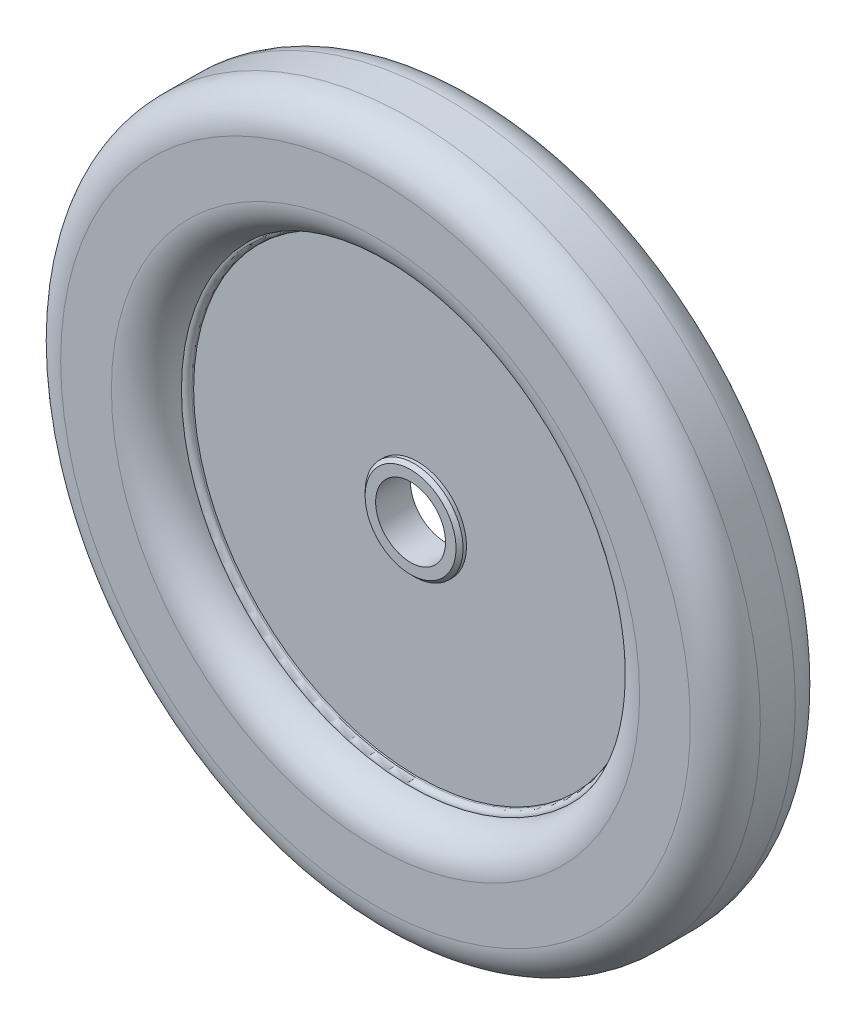
ISO-10303-21;
HEADER;
FILE_DESCRIPTION(('STEP AP214'),'2;1');
FILE_NAME('part.step','',(''),(''),'','','');
FILE_SCHEMA(('AUTOMOTIVE_DESIGN { 1 0 10303 214 1 1 1 1 }'));
ENDSEC;
DATA;
#1=APPLICATION_CONTEXT('core data for automotive mechanical design processes');
#2=APPLICATION_PROTOCOL_DEFINITION('international standard','automotive_design',2000,#1);
#3=PRODUCT_CONTEXT('',#1,'mechanical');
#4=PRODUCT('Part','Part','',(#3));
#5=PRODUCT_RELATED_PRODUCT_CATEGORY('part','',(#4));
#6=PRODUCT_DEFINITION_FORMATION('','',#4);
#7=PRODUCT_DEFINITION_CONTEXT('part definition',#1,'design');
#8=PRODUCT_DEFINITION('design','',#6,#7);
#9=PRODUCT_DEFINITION_SHAPE('','',#8);
#10=(LENGTH_UNIT() NAMED_UNIT(*) SI_UNIT(.MILLI.,.METRE.));
#11=(NAMED_UNIT(*) PLANE_ANGLE_UNIT() SI_UNIT($,.RADIAN.));
#12=(NAMED_UNIT(*) SI_UNIT($,.STERADIAN.) SOLID_ANGLE_UNIT());
#13=UNCERTAINTY_MEASURE_WITH_UNIT(LENGTH_MEASURE(1.E-05),#10,'distance_accuracy_value','');
#14=(GEOMETRIC_REPRESENTATION_CONTEXT(3) GLOBAL_UNCERTAINTY_ASSIGNED_CONTEXT((#13)) GLOBAL_UNIT_ASSIGNED_CONTEXT((#10,
#11,#12)) REPRESENTATION_CONTEXT('',''));
#15=CARTESIAN_POINT('',(0.,0.,0.));
#16=DIRECTION('',(0.,0.,1.));
#17=DIRECTION('',(1.,0.,0.));
#18=AXIS2_PLACEMENT_3D('',#15,#16,#17);
#19=CARTESIAN_POINT('',(0.,0.,-9.95860279538102));
#20=DIRECTION('',(0.,0.,-1.));
#21=DIRECTION('',(-1.,0.,0.));
#22=AXIS2_PLACEMENT_3D('',#19,#20,#21);
#23=CYLINDRICAL_SURFACE('',#22,10.);
#24=CARTESIAN_POINT('',(0.,0.,0.));
#25=DIRECTION('',(0.,0.,-1.));
#26=DIRECTION('',(-1.,0.,0.));
#27=AXIS2_PLACEMENT_3D('',#24,#25,#26);
#28=CIRCLE('',#27,10.);
#29=CARTESIAN_POINT('',(-10.,0.,0.));
#30=VERTEX_POINT('',#29);
#31=EDGE_CURVE('E10',#30,#30,#28,.T.);
#32=ORIENTED_EDGE('',*,*,#31,.F.);
#33=EDGE_LOOP('',(#32));
#34=FACE_BOUND('',#33,.T.);
#35=CARTESIAN_POINT('',(0.,0.,-9.95860279538102));
#36=DIRECTION('',(0.,0.,-1.));
#37=DIRECTION('',(-1.,0.,0.));
#38=AXIS2_PLACEMENT_3D('',#35,#36,#37);
#39=CIRCLE('',#38,10.);
#40=CARTESIAN_POINT('',(-10.,0.,-9.95860279538102));
#41=VERTEX_POINT('',#40);
#42=EDGE_CURVE('E100',#41,#41,#39,.T.);
#43=ORIENTED_EDGE('',*,*,#42,.T.);
#44=EDGE_LOOP('',(#43));
#45=FACE_BOUND('',#44,.T.);
#46=ADVANCED_FACE('F30',(#34,#45),#23,.F.);
#47=CARTESIAN_POINT('',(10.,0.,0.));
#48=DIRECTION('',(0.,0.,-1.));
#49=DIRECTION('',(-1.,0.,0.));
#50=AXIS2_PLACEMENT_3D('',#47,#48,#49);
#51=PLANE('',#50);
#52=CARTESIAN_POINT('',(0.,0.,0.));
#53=DIRECTION('',(0.,0.,-1.));
#54=DIRECTION('',(-1.,0.,0.));
#55=AXIS2_PLACEMENT_3D('',#52,#53,#54);
#56=CIRCLE('',#55,13.);
#57=CARTESIAN_POINT('',(-13.,0.,0.));
#58=VERTEX_POINT('',#57);
#59=EDGE_CURVE('E36',#58,#58,#56,.T.);
#60=ORIENTED_EDGE('',*,*,#59,.F.);
#61=EDGE_LOOP('',(#60));
#62=FACE_BOUND('',#61,.T.);
#63=ORIENTED_EDGE('',*,*,#31,.T.);
#64=EDGE_LOOP('',(#63));
#65=FACE_BOUND('',#64,.T.);
#66=ADVANCED_FACE('F221',(#62,#65),#51,.F.);
#67=CARTESIAN_POINT('',(0.,0.,0.));
#68=DIRECTION('',(0.,0.,-1.));
#69=DIRECTION('',(-1.,0.,0.));
#70=AXIS2_PLACEMENT_3D('',#67,#68,#69);
#71=CONICAL_SURFACE('',#70,13.,0.785398163397448);
#72=CARTESIAN_POINT('',(0.,0.,-1.));
#73=DIRECTION('',(0.,0.,-1.));
#74=DIRECTION('',(-1.,0.,0.));
#75=AXIS2_PLACEMENT_3D('',#72,#73,#74);
#76=CIRCLE('',#75,14.);
#77=CARTESIAN_POINT('',(-14.,0.,-1.));
#78=VERTEX_POINT('',#77);
#79=EDGE_CURVE('E40',#78,#78,#76,.T.);
#80=ORIENTED_EDGE('',*,*,#79,.F.);
#81=EDGE_LOOP('',(#80));
#82=FACE_BOUND('',#81,.T.);
#83=ORIENTED_EDGE('',*,*,#59,.T.);
#84=EDGE_LOOP('',(#83));
#85=FACE_BOUND('',#84,.T.);
#86=ADVANCED_FACE('F216',(#82,#85),#71,.T.);
#87=CARTESIAN_POINT('',(0.,0.,-9.95860279538102));
#88=DIRECTION('',(0.,0.,-1.));
#89=DIRECTION('',(-1.,0.,0.));
#90=AXIS2_PLACEMENT_3D('',#87,#88,#89);
#91=CYLINDRICAL_SURFACE('',#90,14.);
#92=CARTESIAN_POINT('',(0.,0.,-1.97930139769048));
#93=DIRECTION('',(0.,0.,-1.));
#94=DIRECTION('',(-1.,0.,0.));
#95=AXIS2_PLACEMENT_3D('',#92,#93,#94);
#96=CIRCLE('',#95,14.);
#97=CARTESIAN_POINT('',(-14.,0.,-1.97930139769048));
#98=VERTEX_POINT('',#97);
#99=EDGE_CURVE('E44',#98,#98,#96,.T.);
#100=ORIENTED_EDGE('',*,*,#99,.F.);
#101=EDGE_LOOP('',(#100));
#102=FACE_BOUND('',#101,.T.);
#103=ORIENTED_EDGE('',*,*,#79,.T.);
#104=EDGE_LOOP('',(#103));
#105=FACE_BOUND('',#104,.T.);
#106=ADVANCED_FACE('F210',(#102,#105),#91,.T.);
#107=CARTESIAN_POINT('',(14.,0.,-1.97930139769048));
#108=DIRECTION('',(0.,0.,-1.));
#109=DIRECTION('',(-1.,0.,0.));
#110=AXIS2_PLACEMENT_3D('',#107,#108,#109);
#111=PLANE('',#110);
#112=CARTESIAN_POINT('',(0.,0.,-1.97930139769048));
#113=DIRECTION('',(0.,0.,-1.));
#114=DIRECTION('',(-1.,0.,0.));
#115=AXIS2_PLACEMENT_3D('',#112,#113,#114);
#116=CIRCLE('',#115,64.);
#117=CARTESIAN_POINT('',(-64.,0.,-1.97930139769048));
#118=VERTEX_POINT('',#117);
#119=EDGE_CURVE('E49',#118,#118,#116,.T.);
#120=ORIENTED_EDGE('',*,*,#119,.F.);
#121=EDGE_LOOP('',(#120));
#122=FACE_BOUND('',#121,.T.);
#123=ORIENTED_EDGE('',*,*,#99,.T.);
#124=EDGE_LOOP('',(#123));
#125=FACE_BOUND('',#124,.T.);
#126=ADVANCED_FACE('F204',(#122,#125),#111,.F.);
#127=CARTESIAN_POINT('',(0.,0.,-9.95860279538102));
#128=DIRECTION('',(0.,0.,-1.));
#129=DIRECTION('',(-1.,0.,0.));
#130=AXIS2_PLACEMENT_3D('',#127,#128,#129);
#131=CYLINDRICAL_SURFACE('',#130,64.);
#132=CARTESIAN_POINT('',(0.,0.,-1.5));
#133=DIRECTION('',(0.,0.,-1.));
#134=DIRECTION('',(-1.,0.,0.));
#135=AXIS2_PLACEMENT_3D('',#132,#133,#134);
#136=CIRCLE('',#135,64.);
#137=CARTESIAN_POINT('',(-64.,0.,-1.5));
#138=VERTEX_POINT('',#137);
#139=EDGE_CURVE('E52',#138,#138,#136,.T.);
#140=ORIENTED_EDGE('',*,*,#139,.F.);
#141=EDGE_LOOP('',(#140));
#142=FACE_BOUND('',#141,.T.);
#143=ORIENTED_EDGE('',*,*,#119,.T.);
#144=EDGE_LOOP('',(#143));
#145=FACE_BOUND('',#144,.T.);
#146=ADVANCED_FACE('F198',(#142,#145),#131,.F.);
#147=CARTESIAN_POINT('',(0.,0.,-1.5));
#148=DIRECTION('',(0.,0.,-1.));
#149=DIRECTION('',(-1.,0.,0.));
#150=AXIS2_PLACEMENT_3D('',#147,#148,#149);
#151=TOROIDAL_SURFACE('',#150,65.5,1.5);
#152=CARTESIAN_POINT('',(0.,0.,0.));
#153=DIRECTION('',(0.,0.,-1.));
#154=DIRECTION('',(-1.,0.,0.));
#155=AXIS2_PLACEMENT_3D('',#152,#153,#154);
#156=CIRCLE('',#155,65.5);
#157=CARTESIAN_POINT('',(-65.5,0.,0.));
#158=VERTEX_POINT('',#157);
#159=EDGE_CURVE('E55',#158,#158,#156,.T.);
#160=ORIENTED_EDGE('',*,*,#159,.F.);
#161=EDGE_LOOP('',(#160));
#162=FACE_BOUND('',#161,.T.);
#163=ORIENTED_EDGE('',*,*,#139,.T.);
#164=EDGE_LOOP('',(#163));
#165=FACE_BOUND('',#164,.T.);
#166=ADVANCED_FACE('F192',(#162,#165),#151,.T.);
#167=CARTESIAN_POINT('',(0.,0.,-9.95860279538102));
#168=DIRECTION('',(0.,0.,-1.));
#169=DIRECTION('',(-1.,0.,0.));
#170=AXIS2_PLACEMENT_3D('',#167,#168,#169);
#171=CYLINDRICAL_SURFACE('',#170,65.5);
#172=CARTESIAN_POINT('',(0.,0.,0.0206986023094102));
#173=DIRECTION('',(0.,0.,-1.));
#174=DIRECTION('',(-1.,0.,0.));
#175=AXIS2_PLACEMENT_3D('',#172,#173,#174);
#176=CIRCLE('',#175,65.5);
#177=CARTESIAN_POINT('',(-65.5,0.,0.0206986023094102));
#178=VERTEX_POINT('',#177);
#179=EDGE_CURVE('E58',#178,#178,#176,.T.);
#180=ORIENTED_EDGE('',*,*,#179,.F.);
#181=EDGE_LOOP('',(#180));
#182=FACE_BOUND('',#181,.T.);
#183=ORIENTED_EDGE('',*,*,#159,.T.);
#184=EDGE_LOOP('',(#183));
#185=FACE_BOUND('',#184,.T.);
#186=ADVANCED_FACE('F186',(#182,#185),#171,.F.);
#187=CARTESIAN_POINT('',(0.,0.,0.0206986023095213));
#188=DIRECTION('',(0.,0.,-1.));
#189=DIRECTION('',(-1.,0.,0.));
#190=AXIS2_PLACEMENT_3D('',#187,#188,#189);
#191=TOROIDAL_SURFACE('',#190,75.5,10.);
#192=CARTESIAN_POINT('',(0.,0.,10.0206986023095));
#193=DIRECTION('',(0.,0.,-1.));
#194=DIRECTION('',(-1.,0.,0.));
#195=AXIS2_PLACEMENT_3D('',#192,#193,#194);
#196=CIRCLE('',#195,75.5);
#197=CARTESIAN_POINT('',(-75.5,0.,10.0206986023095));
#198=VERTEX_POINT('',#197);
#199=EDGE_CURVE('E61',#198,#198,#196,.T.);
#200=ORIENTED_EDGE('',*,*,#199,.F.);
#201=EDGE_LOOP('',(#200));
#202=FACE_BOUND('',#201,.T.);
#203=ORIENTED_EDGE('',*,*,#179,.T.);
#204=EDGE_LOOP('',(#203));
#205=FACE_BOUND('',#204,.T.);
#206=ADVANCED_FACE('F180',(#202,#205),#191,.T.);
#207=CARTESIAN_POINT('',(75.5000000000001,0.,10.0206986023095));
#208=DIRECTION('',(0.,0.,-1.));
#209=DIRECTION('',(-1.,0.,0.));
#210=AXIS2_PLACEMENT_3D('',#207,#208,#209);
#211=PLANE('',#210);
#212=CARTESIAN_POINT('',(0.,0.,10.0206986023095));
#213=DIRECTION('',(0.,0.,-1.));
#214=DIRECTION('',(-1.,0.,0.));
#215=AXIS2_PLACEMENT_3D('',#212,#213,#214);
#216=CIRCLE('',#215,89.9999999999999);
#217=CARTESIAN_POINT('',(-89.9999999999999,0.,10.0206986023095));
#218=VERTEX_POINT('',#217);
#219=EDGE_CURVE('E64',#218,#218,#216,.T.);
#220=ORIENTED_EDGE('',*,*,#219,.F.);
#221=EDGE_LOOP('',(#220));
#222=FACE_BOUND('',#221,.T.);
#223=ORIENTED_EDGE('',*,*,#199,.T.);
#224=EDGE_LOOP('',(#223));
#225=FACE_BOUND('',#224,.T.);
#226=ADVANCED_FACE('F174',(#222,#225),#211,.F.);
#227=CARTESIAN_POINT('',(0.,0.,0.0206986023095213));
#228=DIRECTION('',(0.,0.,-1.));
#229=DIRECTION('',(-1.,0.,0.));
#230=AXIS2_PLACEMENT_3D('',#227,#228,#229);
#231=TOROIDAL_SURFACE('',#230,90.,10.);
#232=CARTESIAN_POINT('',(0.,0.,0.0206986023094102));
#233=DIRECTION('',(0.,0.,-1.));
#234=DIRECTION('',(-1.,0.,0.));
#235=AXIS2_PLACEMENT_3D('',#232,#233,#234);
#236=CIRCLE('',#235,100.);
#237=CARTESIAN_POINT('',(-100.,0.,0.0206986023094102));
#238=VERTEX_POINT('',#237);
#239=EDGE_CURVE('E67',#238,#238,#236,.T.);
#240=ORIENTED_EDGE('',*,*,#239,.F.);
#241=EDGE_LOOP('',(#240));
#242=FACE_BOUND('',#241,.T.);
#243=ORIENTED_EDGE('',*,*,#219,.T.);
#244=EDGE_LOOP('',(#243));
#245=FACE_BOUND('',#244,.T.);
#246=ADVANCED_FACE('F168',(#242,#245),#231,.T.);
#247=CARTESIAN_POINT('',(0.,0.,-9.95860279538102));
#248=DIRECTION('',(0.,0.,-1.));
#249=DIRECTION('',(-1.,0.,0.));
#250=AXIS2_PLACEMENT_3D('',#247,#248,#249);
#251=CYLINDRICAL_SURFACE('',#250,100.);
#252=CARTESIAN_POINT('',(0.,0.,-9.97930139769043));
#253=DIRECTION('',(0.,0.,-1.));
#254=DIRECTION('',(-1.,0.,0.));
#255=AXIS2_PLACEMENT_3D('',#252,#253,#254);
#256=CIRCLE('',#255,100.);
#257=CARTESIAN_POINT('',(-100.,0.,-9.97930139769043));
#258=VERTEX_POINT('',#257);
#259=EDGE_CURVE('E70',#258,#258,#256,.T.);
#260=ORIENTED_EDGE('',*,*,#259,.F.);
#261=EDGE_LOOP('',(#260));
#262=FACE_BOUND('',#261,.T.);
#263=ORIENTED_EDGE('',*,*,#239,.T.);
#264=EDGE_LOOP('',(#263));
#265=FACE_BOUND('',#264,.T.);
#266=ADVANCED_FACE('F162',(#262,#265),#251,.T.);
#267=CARTESIAN_POINT('',(0.,0.,-9.97930139769049));
#268=DIRECTION('',(0.,0.,-1.));
#269=DIRECTION('',(-1.,0.,0.));
#270=AXIS2_PLACEMENT_3D('',#267,#268,#269);
#271=TOROIDAL_SURFACE('',#270,90.,10.);
#272=CARTESIAN_POINT('',(0.,0.,-19.9793013976905));
#273=DIRECTION('',(0.,0.,-1.));
#274=DIRECTION('',(-1.,0.,0.));
#275=AXIS2_PLACEMENT_3D('',#272,#273,#274);
#276=CIRCLE('',#275,89.9999999999999);
#277=CARTESIAN_POINT('',(-89.9999999999999,0.,-19.9793013976905));
#278=VERTEX_POINT('',#277);
#279=EDGE_CURVE('E73',#278,#278,#276,.T.);
#280=ORIENTED_EDGE('',*,*,#279,.F.);
#281=EDGE_LOOP('',(#280));
#282=FACE_BOUND('',#281,.T.);
#283=ORIENTED_EDGE('',*,*,#259,.T.);
#284=EDGE_LOOP('',(#283));
#285=FACE_BOUND('',#284,.T.);
#286=ADVANCED_FACE('F156',(#282,#285),#271,.T.);
#287=CARTESIAN_POINT('',(75.5000000000001,0.,-19.9793013976905));
#288=DIRECTION('',(0.,0.,1.));
#289=DIRECTION('',(1.,0.,0.));
#290=AXIS2_PLACEMENT_3D('',#287,#288,#289);
#291=PLANE('',#290);
#292=CARTESIAN_POINT('',(0.,0.,-19.9793013976905));
#293=DIRECTION('',(0.,0.,-1.));
#294=DIRECTION('',(-1.,0.,0.));
#295=AXIS2_PLACEMENT_3D('',#292,#293,#294);
#296=CIRCLE('',#295,75.5000000000001);
#297=CARTESIAN_POINT('',(-75.5000000000001,0.,-19.9793013976905));
#298=VERTEX_POINT('',#297);
#299=EDGE_CURVE('E76',#298,#298,#296,.T.);
#300=ORIENTED_EDGE('',*,*,#299,.F.);
#301=EDGE_LOOP('',(#300));
#302=FACE_BOUND('',#301,.T.);
#303=ORIENTED_EDGE('',*,*,#279,.T.);
#304=EDGE_LOOP('',(#303));
#305=FACE_BOUND('',#304,.T.);
#306=ADVANCED_FACE('F150',(#302,#305),#291,.F.);
#307=CARTESIAN_POINT('',(0.,0.,-9.97930139769049));
#308=DIRECTION('',(0.,0.,-1.));
#309=DIRECTION('',(-1.,0.,0.));
#310=AXIS2_PLACEMENT_3D('',#307,#308,#309);
#311=TOROIDAL_SURFACE('',#310,75.5,10.);
#312=CARTESIAN_POINT('',(0.,0.,-9.97930139769043));
#313=DIRECTION('',(0.,0.,-1.));
#314=DIRECTION('',(-1.,0.,0.));
#315=AXIS2_PLACEMENT_3D('',#312,#313,#314);
#316=CIRCLE('',#315,65.5);
#317=CARTESIAN_POINT('',(-65.5,0.,-9.97930139769043));
#318=VERTEX_POINT('',#317);
#319=EDGE_CURVE('E79',#318,#318,#316,.T.);
#320=ORIENTED_EDGE('',*,*,#319,.F.);
#321=EDGE_LOOP('',(#320));
#322=FACE_BOUND('',#321,.T.);
#323=ORIENTED_EDGE('',*,*,#299,.T.);
#324=EDGE_LOOP('',(#323));
#325=FACE_BOUND('',#324,.T.);
#326=ADVANCED_FACE('F144',(#322,#325),#311,.T.);
#327=CARTESIAN_POINT('',(0.,0.,-9.95860279538102));
#328=DIRECTION('',(0.,0.,-1.));
#329=DIRECTION('',(-1.,0.,0.));
#330=AXIS2_PLACEMENT_3D('',#327,#328,#329);
#331=CYLINDRICAL_SURFACE('',#330,65.5);
#332=CARTESIAN_POINT('',(0.,0.,-9.95860279538102));
#333=DIRECTION('',(0.,0.,-1.));
#334=DIRECTION('',(-1.,0.,0.));
#335=AXIS2_PLACEMENT_3D('',#332,#333,#334);
#336=CIRCLE('',#335,65.5);
#337=CARTESIAN_POINT('',(-65.5,0.,-9.95860279538102));
#338=VERTEX_POINT('',#337);
#339=EDGE_CURVE('E82',#338,#338,#336,.T.);
#340=ORIENTED_EDGE('',*,*,#339,.F.);
#341=EDGE_LOOP('',(#340));
#342=FACE_BOUND('',#341,.T.);
#343=ORIENTED_EDGE('',*,*,#319,.T.);
#344=EDGE_LOOP('',(#343));
#345=FACE_BOUND('',#344,.T.);
#346=ADVANCED_FACE('F138',(#342,#345),#331,.F.);
#347=CARTESIAN_POINT('',(0.,0.,-8.45860279538102));
#348=DIRECTION('',(0.,0.,-1.));
#349=DIRECTION('',(-1.,0.,0.));
#350=AXIS2_PLACEMENT_3D('',#347,#348,#349);
#351=TOROIDAL_SURFACE('',#350,65.5,1.5);
#352=CARTESIAN_POINT('',(0.,0.,-8.45860279538102));
#353=DIRECTION('',(0.,0.,-1.));
#354=DIRECTION('',(-1.,0.,0.));
#355=AXIS2_PLACEMENT_3D('',#352,#353,#354);
#356=CIRCLE('',#355,64.);
#357=CARTESIAN_POINT('',(-64.,0.,-8.45860279538102));
#358=VERTEX_POINT('',#357);
#359=EDGE_CURVE('E85',#358,#358,#356,.T.);
#360=ORIENTED_EDGE('',*,*,#359,.F.);
#361=EDGE_LOOP('',(#360));
#362=FACE_BOUND('',#361,.T.);
#363=ORIENTED_EDGE('',*,*,#339,.T.);
#364=EDGE_LOOP('',(#363));
#365=FACE_BOUND('',#364,.T.);
#366=ADVANCED_FACE('F132',(#362,#365),#351,.T.);
#367=CARTESIAN_POINT('',(0.,0.,-9.95860279538102));
#368=DIRECTION('',(0.,0.,-1.));
#369=DIRECTION('',(-1.,0.,0.));
#370=AXIS2_PLACEMENT_3D('',#367,#368,#369);
#371=CYLINDRICAL_SURFACE('',#370,64.);
#372=CARTESIAN_POINT('',(0.,0.,-7.97930139769049));
#373=DIRECTION('',(0.,0.,-1.));
#374=DIRECTION('',(-1.,0.,0.));
#375=AXIS2_PLACEMENT_3D('',#372,#373,#374);
#376=CIRCLE('',#375,64.);
#377=CARTESIAN_POINT('',(-64.,0.,-7.97930139769049));
#378=VERTEX_POINT('',#377);
#379=EDGE_CURVE('E88',#378,#378,#376,.T.);
#380=ORIENTED_EDGE('',*,*,#379,.F.);
#381=EDGE_LOOP('',(#380));
#382=FACE_BOUND('',#381,.T.);
#383=ORIENTED_EDGE('',*,*,#359,.T.);
#384=EDGE_LOOP('',(#383));
#385=FACE_BOUND('',#384,.T.);
#386=ADVANCED_FACE('F126',(#382,#385),#371,.F.);
#387=CARTESIAN_POINT('',(14.,0.,-7.97930139769049));
#388=DIRECTION('',(0.,0.,1.));
#389=DIRECTION('',(1.,0.,0.));
#390=AXIS2_PLACEMENT_3D('',#387,#388,#389);
#391=PLANE('',#390);
#392=CARTESIAN_POINT('',(0.,0.,-7.97930139769049));
#393=DIRECTION('',(0.,0.,-1.));
#394=DIRECTION('',(-1.,0.,0.));
#395=AXIS2_PLACEMENT_3D('',#392,#393,#394);
#396=CIRCLE('',#395,14.);
#397=CARTESIAN_POINT('',(-14.,0.,-7.97930139769049));
#398=VERTEX_POINT('',#397);
#399=EDGE_CURVE('E91',#398,#398,#396,.T.);
#400=ORIENTED_EDGE('',*,*,#399,.F.);
#401=EDGE_LOOP('',(#400));
#402=FACE_BOUND('',#401,.T.);
#403=ORIENTED_EDGE('',*,*,#379,.T.);
#404=EDGE_LOOP('',(#403));
#405=FACE_BOUND('',#404,.T.);
#406=ADVANCED_FACE('F120',(#402,#405),#391,.F.);
#407=CARTESIAN_POINT('',(0.,0.,-9.95860279538102));
#408=DIRECTION('',(0.,0.,-1.));
#409=DIRECTION('',(-1.,0.,0.));
#410=AXIS2_PLACEMENT_3D('',#407,#408,#409);
#411=CYLINDRICAL_SURFACE('',#410,14.);
#412=CARTESIAN_POINT('',(0.,0.,-8.95860279538102));
#413=DIRECTION('',(0.,0.,-1.));
#414=DIRECTION('',(-1.,0.,0.));
#415=AXIS2_PLACEMENT_3D('',#412,#413,#414);
#416=CIRCLE('',#415,14.);
#417=CARTESIAN_POINT('',(-14.,0.,-8.95860279538102));
#418=VERTEX_POINT('',#417);
#419=EDGE_CURVE('E94',#418,#418,#416,.T.);
#420=ORIENTED_EDGE('',*,*,#419,.F.);
#421=EDGE_LOOP('',(#420));
#422=FACE_BOUND('',#421,.T.);
#423=ORIENTED_EDGE('',*,*,#399,.T.);
#424=EDGE_LOOP('',(#423));
#425=FACE_BOUND('',#424,.T.);
#426=ADVANCED_FACE('F114',(#422,#425),#411,.T.);
#427=CARTESIAN_POINT('',(0.,0.,-8.95860279538102));
#428=DIRECTION('',(0.,0.,1.));
#429=DIRECTION('',(1.,0.,0.));
#430=AXIS2_PLACEMENT_3D('',#427,#428,#429);
#431=CONICAL_SURFACE('',#430,14.,0.785398163397447);
#432=CARTESIAN_POINT('',(0.,0.,-9.95860279538102));
#433=DIRECTION('',(0.,0.,-1.));
#434=DIRECTION('',(-1.,0.,0.));
#435=AXIS2_PLACEMENT_3D('',#432,#433,#434);
#436=CIRCLE('',#435,13.);
#437=CARTESIAN_POINT('',(-13.,0.,-9.95860279538102));
#438=VERTEX_POINT('',#437);
#439=EDGE_CURVE('E97',#438,#438,#436,.T.);
#440=ORIENTED_EDGE('',*,*,#439,.F.);
#441=EDGE_LOOP('',(#440));
#442=FACE_BOUND('',#441,.T.);
#443=ORIENTED_EDGE('',*,*,#419,.T.);
#444=EDGE_LOOP('',(#443));
#445=FACE_BOUND('',#444,.T.);
#446=ADVANCED_FACE('F108',(#442,#445),#431,.T.);
#447=CARTESIAN_POINT('',(13.,0.,-9.95860279538102));
#448=DIRECTION('',(0.,0.,1.));
#449=DIRECTION('',(1.,0.,0.));
#450=AXIS2_PLACEMENT_3D('',#447,#448,#449);
#451=PLANE('',#450);
#452=ORIENTED_EDGE('',*,*,#42,.F.);
#453=EDGE_LOOP('',(#452));
#454=FACE_BOUND('',#453,.T.);
#455=ORIENTED_EDGE('',*,*,#439,.T.);
#456=EDGE_LOOP('',(#455));
#457=FACE_BOUND('',#456,.T.);
#458=ADVANCED_FACE('F105',(#454,#457),#451,.F.);
#459=CLOSED_SHELL('',(#46,#66,#86,#106,#126,#146,#166,#186,#206,#226,#246,#266,#286,#306,#326,
#346,#366,#386,#406,#426,#446,#458));
#460=MANIFOLD_SOLID_BREP('B2',#459);
#461=ADVANCED_BREP_SHAPE_REPRESENTATION('',(#18,#460),#14);
#462=SHAPE_DEFINITION_REPRESENTATION(#9,#461);
ENDSEC;
END-ISO-10303-21;
